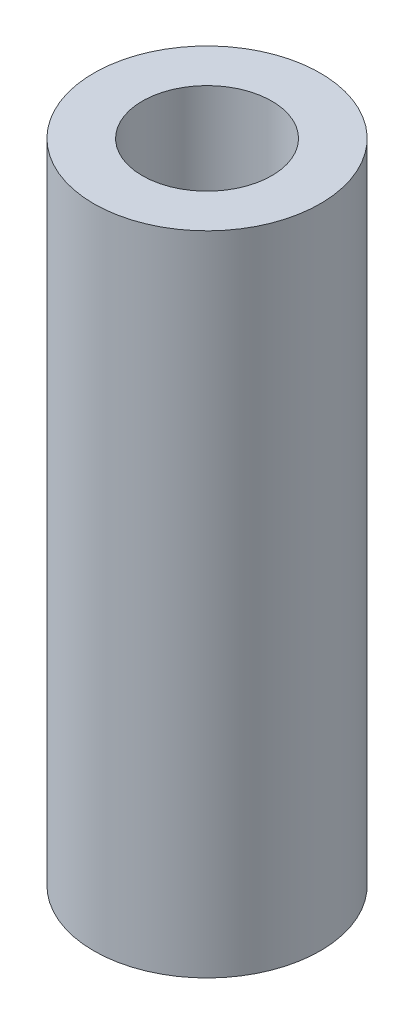
ISO-10303-21;
HEADER;
FILE_DESCRIPTION(('STEP AP214'),'2;1');
FILE_NAME('part.step','',(''),(''),'','','');
FILE_SCHEMA(('AUTOMOTIVE_DESIGN { 1 0 10303 214 1 1 1 1 }'));
ENDSEC;
DATA;
#1=APPLICATION_CONTEXT('core data for automotive mechanical design processes');
#2=APPLICATION_PROTOCOL_DEFINITION('international standard','automotive_design',2000,#1);
#3=PRODUCT_CONTEXT('',#1,'mechanical');
#4=PRODUCT('Part','Part','',(#3));
#5=PRODUCT_RELATED_PRODUCT_CATEGORY('part','',(#4));
#6=PRODUCT_DEFINITION_FORMATION('','',#4);
#7=PRODUCT_DEFINITION_CONTEXT('part definition',#1,'design');
#8=PRODUCT_DEFINITION('design','',#6,#7);
#9=PRODUCT_DEFINITION_SHAPE('','',#8);
#10=(LENGTH_UNIT() NAMED_UNIT(*) SI_UNIT(.MILLI.,.METRE.));
#11=(NAMED_UNIT(*) PLANE_ANGLE_UNIT() SI_UNIT($,.RADIAN.));
#12=(NAMED_UNIT(*) SI_UNIT($,.STERADIAN.) SOLID_ANGLE_UNIT());
#13=UNCERTAINTY_MEASURE_WITH_UNIT(LENGTH_MEASURE(1.E-05),#10,'distance_accuracy_value','');
#14=(GEOMETRIC_REPRESENTATION_CONTEXT(3) GLOBAL_UNCERTAINTY_ASSIGNED_CONTEXT((#13)) GLOBAL_UNIT_ASSIGNED_CONTEXT((#10,
#11,#12)) REPRESENTATION_CONTEXT('',''));
#15=CARTESIAN_POINT('',(0.,0.,0.));
#16=DIRECTION('',(0.,0.,1.));
#17=DIRECTION('',(1.,0.,0.));
#18=AXIS2_PLACEMENT_3D('',#15,#16,#17);
#19=CARTESIAN_POINT('',(0.,20.,0.));
#20=DIRECTION('',(0.,1.,0.));
#21=DIRECTION('',(0.,0.,1.));
#22=AXIS2_PLACEMENT_3D('',#19,#20,#21);
#23=PLANE('',#22);
#24=CARTESIAN_POINT('',(0.,20.,0.));
#25=DIRECTION('',(0.,1.,0.));
#26=DIRECTION('',(0.,0.,1.));
#27=AXIS2_PLACEMENT_3D('',#24,#25,#26);
#28=CIRCLE('',#27,3.5);
#29=CARTESIAN_POINT('',(0.,20.,3.5));
#30=VERTEX_POINT('',#29);
#31=EDGE_CURVE('E10',#30,#30,#28,.T.);
#32=ORIENTED_EDGE('',*,*,#31,.T.);
#33=EDGE_LOOP('',(#32));
#34=FACE_BOUND('',#33,.T.);
#35=CARTESIAN_POINT('',(0.,20.,0.));
#36=DIRECTION('',(0.,1.,0.));
#37=DIRECTION('',(0.,0.,1.));
#38=AXIS2_PLACEMENT_3D('',#35,#36,#37);
#39=CIRCLE('',#38,2.);
#40=CARTESIAN_POINT('',(0.,20.,2.));
#41=VERTEX_POINT('',#40);
#42=EDGE_CURVE('E48',#41,#41,#39,.T.);
#43=ORIENTED_EDGE('',*,*,#42,.F.);
#44=EDGE_LOOP('',(#43));
#45=FACE_BOUND('',#44,.T.);
#46=ADVANCED_FACE('F37',(#34,#45),#23,.T.);
#47=CARTESIAN_POINT('',(0.,0.,0.));
#48=DIRECTION('',(0.,1.,0.));
#49=DIRECTION('',(0.,0.,1.));
#50=AXIS2_PLACEMENT_3D('',#47,#48,#49);
#51=PLANE('',#50);
#52=CARTESIAN_POINT('',(0.,0.,0.));
#53=DIRECTION('',(0.,1.,0.));
#54=DIRECTION('',(0.,0.,1.));
#55=AXIS2_PLACEMENT_3D('',#52,#53,#54);
#56=CIRCLE('',#55,3.5);
#57=CARTESIAN_POINT('',(0.,0.,3.5));
#58=VERTEX_POINT('',#57);
#59=EDGE_CURVE('E41',#58,#58,#56,.T.);
#60=ORIENTED_EDGE('',*,*,#59,.F.);
#61=EDGE_LOOP('',(#60));
#62=FACE_BOUND('',#61,.T.);
#63=CARTESIAN_POINT('',(0.,0.,0.));
#64=DIRECTION('',(0.,1.,0.));
#65=DIRECTION('',(0.,0.,1.));
#66=AXIS2_PLACEMENT_3D('',#63,#64,#65);
#67=CIRCLE('',#66,2.);
#68=CARTESIAN_POINT('',(0.,0.,2.));
#69=VERTEX_POINT('',#68);
#70=EDGE_CURVE('E50',#69,#69,#67,.T.);
#71=ORIENTED_EDGE('',*,*,#70,.T.);
#72=EDGE_LOOP('',(#71));
#73=FACE_BOUND('',#72,.T.);
#74=ADVANCED_FACE('F60',(#62,#73),#51,.F.);
#75=CARTESIAN_POINT('',(0.,20.,0.));
#76=DIRECTION('',(0.,-1.,0.));
#77=DIRECTION('',(0.,0.,-1.));
#78=AXIS2_PLACEMENT_3D('',#75,#76,#77);
#79=CYLINDRICAL_SURFACE('',#78,3.5);
#80=ORIENTED_EDGE('',*,*,#31,.F.);
#81=EDGE_LOOP('',(#80));
#82=FACE_BOUND('',#81,.T.);
#83=ORIENTED_EDGE('',*,*,#59,.T.);
#84=EDGE_LOOP('',(#83));
#85=FACE_BOUND('',#84,.T.);
#86=ADVANCED_FACE('F39',(#82,#85),#79,.T.);
#87=CARTESIAN_POINT('',(0.,20.,0.));
#88=DIRECTION('',(0.,-1.,0.));
#89=DIRECTION('',(0.,0.,-1.));
#90=AXIS2_PLACEMENT_3D('',#87,#88,#89);
#91=CYLINDRICAL_SURFACE('',#90,2.);
#92=ORIENTED_EDGE('',*,*,#42,.T.);
#93=EDGE_LOOP('',(#92));
#94=FACE_BOUND('',#93,.T.);
#95=ORIENTED_EDGE('',*,*,#70,.F.);
#96=EDGE_LOOP('',(#95));
#97=FACE_BOUND('',#96,.T.);
#98=ADVANCED_FACE('F56',(#94,#97),#91,.F.);
#99=CLOSED_SHELL('',(#46,#74,#86,#98));
#100=MANIFOLD_SOLID_BREP('B2',#99);
#101=ADVANCED_BREP_SHAPE_REPRESENTATION('',(#18,#100),#14);
#102=SHAPE_DEFINITION_REPRESENTATION(#9,#101);
ENDSEC;
END-ISO-10303-21;
